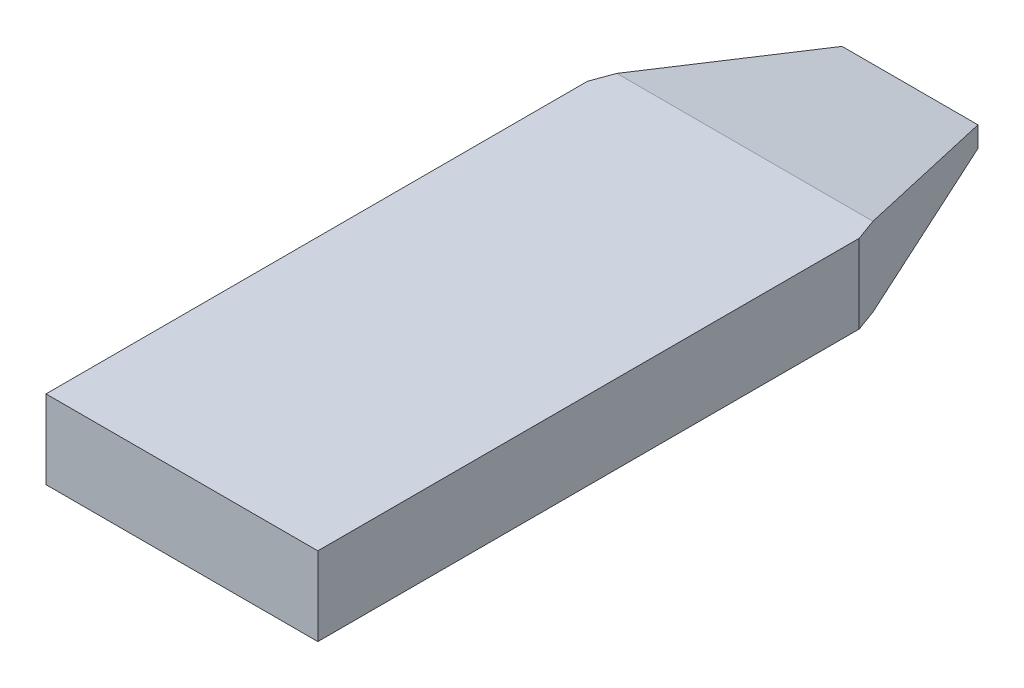
ISO-10303-21;
HEADER;
FILE_DESCRIPTION(('STEP AP214'),'2;1');
FILE_NAME('part.step','',(''),(''),'','','');
FILE_SCHEMA(('AUTOMOTIVE_DESIGN { 1 0 10303 214 1 1 1 1 }'));
ENDSEC;
DATA;
#1=APPLICATION_CONTEXT('core data for automotive mechanical design processes');
#2=APPLICATION_PROTOCOL_DEFINITION('international standard','automotive_design',2000,#1);
#3=PRODUCT_CONTEXT('',#1,'mechanical');
#4=PRODUCT('Part','Part','',(#3));
#5=PRODUCT_RELATED_PRODUCT_CATEGORY('part','',(#4));
#6=PRODUCT_DEFINITION_FORMATION('','',#4);
#7=PRODUCT_DEFINITION_CONTEXT('part definition',#1,'design');
#8=PRODUCT_DEFINITION('design','',#6,#7);
#9=PRODUCT_DEFINITION_SHAPE('','',#8);
#10=(LENGTH_UNIT() NAMED_UNIT(*) SI_UNIT(.MILLI.,.METRE.));
#11=(NAMED_UNIT(*) PLANE_ANGLE_UNIT() SI_UNIT($,.RADIAN.));
#12=(NAMED_UNIT(*) SI_UNIT($,.STERADIAN.) SOLID_ANGLE_UNIT());
#13=UNCERTAINTY_MEASURE_WITH_UNIT(LENGTH_MEASURE(1.E-05),#10,'distance_accuracy_value','');
#14=(GEOMETRIC_REPRESENTATION_CONTEXT(3) GLOBAL_UNCERTAINTY_ASSIGNED_CONTEXT((#13)) GLOBAL_UNIT_ASSIGNED_CONTEXT((#10,
#11,#12)) REPRESENTATION_CONTEXT('',''));
#15=CARTESIAN_POINT('',(0.,0.,0.));
#16=DIRECTION('',(0.,0.,1.));
#17=DIRECTION('',(1.,0.,0.));
#18=AXIS2_PLACEMENT_3D('',#15,#16,#17);
#19=CARTESIAN_POINT('',(3.25,-0.255,-6.64930772705734));
#20=DIRECTION('',(0.,-0.984807753012208,-0.17364817766693));
#21=DIRECTION('',(0.,0.17364817766693,-0.984807753012208));
#22=AXIS2_PLACEMENT_3D('',#19,#20,#21);
#23=PLANE('',#22);
#24=DIRECTION('',(0.337419706756524,-0.163464460888851,0.92705302519255));
#25=VECTOR('',#24,1.);
#26=CARTESIAN_POINT('',(4.65,-0.105,-7.5));
#27=LINE('',#26,#25);
#28=CARTESIAN_POINT('',(4.65,-0.105,-7.5));
#29=VERTEX_POINT('',#28);
#30=CARTESIAN_POINT('',(5.26925333174277,-0.405,-5.79861545411469));
#31=VERTEX_POINT('',#30);
#32=EDGE_CURVE('E11',#29,#31,#27,.T.);
#33=ORIENTED_EDGE('',*,*,#32,.T.);
#34=DIRECTION('',(-1.,0.,0.));
#35=VECTOR('',#34,1.);
#36=CARTESIAN_POINT('',(5.26925333174277,-0.405,-5.79861545411469));
#37=LINE('',#36,#35);
#38=CARTESIAN_POINT('',(2.63074666825723,-0.405,-5.79861545411469));
#39=VERTEX_POINT('',#38);
#40=EDGE_CURVE('E24',#31,#39,#37,.T.);
#41=ORIENTED_EDGE('',*,*,#40,.T.);
#42=DIRECTION('',(0.337419706756524,0.163464460888851,-0.92705302519255));
#43=VECTOR('',#42,1.);
#44=CARTESIAN_POINT('',(2.63074666825723,-0.405,-5.79861545411469));
#45=LINE('',#44,#43);
#46=CARTESIAN_POINT('',(3.25,-0.105,-7.5));
#47=VERTEX_POINT('',#46);
#48=EDGE_CURVE('E142',#39,#47,#45,.T.);
#49=ORIENTED_EDGE('',*,*,#48,.T.);
#50=DIRECTION('',(1.,0.,0.));
#51=VECTOR('',#50,1.);
#52=CARTESIAN_POINT('',(3.25,-0.105,-7.5));
#53=LINE('',#52,#51);
#54=EDGE_CURVE('E140',#47,#29,#53,.T.);
#55=ORIENTED_EDGE('',*,*,#54,.T.);
#56=EDGE_LOOP('',(#33,#41,#49,#55));
#57=FACE_BOUND('',#56,.T.);
#58=ADVANCED_FACE('F17',(#57),#23,.T.);
#59=CARTESIAN_POINT('',(3.95,0.,-7.5));
#60=DIRECTION('',(0.,0.,1.));
#61=DIRECTION('',(1.,0.,0.));
#62=AXIS2_PLACEMENT_3D('',#59,#60,#61);
#63=PLANE('',#62);
#64=ORIENTED_EDGE('',*,*,#54,.F.);
#65=DIRECTION('',(0.,-1.,0.));
#66=VECTOR('',#65,1.);
#67=CARTESIAN_POINT('',(3.25,0.105,-7.5));
#68=LINE('',#67,#66);
#69=CARTESIAN_POINT('',(3.25,0.105,-7.5));
#70=VERTEX_POINT('',#69);
#71=EDGE_CURVE('E137',#70,#47,#68,.T.);
#72=ORIENTED_EDGE('',*,*,#71,.F.);
#73=DIRECTION('',(-1.,0.,0.));
#74=VECTOR('',#73,1.);
#75=CARTESIAN_POINT('',(4.65,0.105,-7.5));
#76=LINE('',#75,#74);
#77=CARTESIAN_POINT('',(4.65,0.105,-7.5));
#78=VERTEX_POINT('',#77);
#79=EDGE_CURVE('E134',#78,#70,#76,.T.);
#80=ORIENTED_EDGE('',*,*,#79,.F.);
#81=DIRECTION('',(0.,1.,0.));
#82=VECTOR('',#81,1.);
#83=CARTESIAN_POINT('',(4.65,-0.105,-7.5));
#84=LINE('',#83,#82);
#85=EDGE_CURVE('E132',#29,#78,#84,.T.);
#86=ORIENTED_EDGE('',*,*,#85,.F.);
#87=EDGE_LOOP('',(#64,#72,#80,#86));
#88=FACE_BOUND('',#87,.T.);
#89=ADVANCED_FACE('F149',(#88),#63,.F.);
#90=CARTESIAN_POINT('',(2.9,0.2025,-6.53838290319088));
#91=DIRECTION('',(-0.939692620785908,0.,-0.342020143325669));
#92=DIRECTION('',(-0.342020143325669,0.,0.939692620785908));
#93=AXIS2_PLACEMENT_3D('',#90,#91,#92);
#94=PLANE('',#93);
#95=ORIENTED_EDGE('',*,*,#48,.F.);
#96=DIRECTION('',(-0.342020143325669,0.,0.939692620785908));
#97=VECTOR('',#96,1.);
#98=CARTESIAN_POINT('',(2.63074666825723,-0.405,-5.79861545411469));
#99=LINE('',#98,#97);
#100=CARTESIAN_POINT('',(2.55,-0.405,-5.57676580638176));
#101=VERTEX_POINT('',#100);
#102=EDGE_CURVE('E130',#39,#101,#99,.T.);
#103=ORIENTED_EDGE('',*,*,#102,.T.);
#104=DIRECTION('',(0.,1.,0.));
#105=VECTOR('',#104,1.);
#106=CARTESIAN_POINT('',(2.55,-0.405,-5.57676580638176));
#107=LINE('',#106,#105);
#108=CARTESIAN_POINT('',(2.55,0.405,-5.57676580638176));
#109=VERTEX_POINT('',#108);
#110=EDGE_CURVE('E96',#101,#109,#107,.T.);
#111=ORIENTED_EDGE('',*,*,#110,.T.);
#112=DIRECTION('',(0.342020143325669,0.,-0.939692620785908));
#113=VECTOR('',#112,1.);
#114=CARTESIAN_POINT('',(2.55,0.405,-5.57676580638176));
#115=LINE('',#114,#113);
#116=CARTESIAN_POINT('',(2.63074666825723,0.405,-5.79861545411469));
#117=VERTEX_POINT('',#116);
#118=EDGE_CURVE('E127',#109,#117,#115,.T.);
#119=ORIENTED_EDGE('',*,*,#118,.T.);
#120=DIRECTION('',(-0.337419706756524,0.163464460888851,0.92705302519255));
#121=VECTOR('',#120,1.);
#122=CARTESIAN_POINT('',(3.25,0.105,-7.5));
#123=LINE('',#122,#121);
#124=EDGE_CURVE('E124',#70,#117,#123,.T.);
#125=ORIENTED_EDGE('',*,*,#124,.F.);
#126=ORIENTED_EDGE('',*,*,#71,.T.);
#127=EDGE_LOOP('',(#95,#103,#111,#119,#125,#126));
#128=FACE_BOUND('',#127,.T.);
#129=ADVANCED_FACE('F146',(#128),#94,.T.);
#130=CARTESIAN_POINT('',(4.65,0.255,-6.64930772705734));
#131=DIRECTION('',(0.,0.984807753012208,-0.17364817766693));
#132=DIRECTION('',(0.,0.17364817766693,0.984807753012208));
#133=AXIS2_PLACEMENT_3D('',#130,#131,#132);
#134=PLANE('',#133);
#135=ORIENTED_EDGE('',*,*,#124,.T.);
#136=DIRECTION('',(1.,0.,0.));
#137=VECTOR('',#136,1.);
#138=CARTESIAN_POINT('',(2.63074666825723,0.405,-5.79861545411469));
#139=LINE('',#138,#137);
#140=CARTESIAN_POINT('',(5.26925333174277,0.405,-5.79861545411469));
#141=VERTEX_POINT('',#140);
#142=EDGE_CURVE('E122',#117,#141,#139,.T.);
#143=ORIENTED_EDGE('',*,*,#142,.T.);
#144=DIRECTION('',(-0.337419706756524,-0.163464460888851,-0.92705302519255));
#145=VECTOR('',#144,1.);
#146=CARTESIAN_POINT('',(5.26925333174277,0.405,-5.79861545411469));
#147=LINE('',#146,#145);
#148=EDGE_CURVE('E119',#141,#78,#147,.T.);
#149=ORIENTED_EDGE('',*,*,#148,.T.);
#150=ORIENTED_EDGE('',*,*,#79,.T.);
#151=EDGE_LOOP('',(#135,#143,#149,#150));
#152=FACE_BOUND('',#151,.T.);
#153=ADVANCED_FACE('F152',(#152),#134,.T.);
#154=CARTESIAN_POINT('',(5.35,0.405,0.));
#155=DIRECTION('',(0.,1.,0.));
#156=DIRECTION('',(0.,0.,1.));
#157=AXIS2_PLACEMENT_3D('',#154,#155,#156);
#158=PLANE('',#157);
#159=ORIENTED_EDGE('',*,*,#142,.F.);
#160=ORIENTED_EDGE('',*,*,#118,.F.);
#161=DIRECTION('',(0.,0.,-1.));
#162=VECTOR('',#161,1.);
#163=CARTESIAN_POINT('',(2.55,0.405,0.));
#164=LINE('',#163,#162);
#165=CARTESIAN_POINT('',(2.55,0.405,0.));
#166=VERTEX_POINT('',#165);
#167=EDGE_CURVE('E117',#166,#109,#164,.T.);
#168=ORIENTED_EDGE('',*,*,#167,.F.);
#169=DIRECTION('',(-1.,0.,0.));
#170=VECTOR('',#169,1.);
#171=CARTESIAN_POINT('',(5.35,0.405,0.));
#172=LINE('',#171,#170);
#173=CARTESIAN_POINT('',(5.35,0.405,0.));
#174=VERTEX_POINT('',#173);
#175=EDGE_CURVE('E101',#174,#166,#172,.T.);
#176=ORIENTED_EDGE('',*,*,#175,.F.);
#177=DIRECTION('',(0.,0.,-1.));
#178=VECTOR('',#177,1.);
#179=CARTESIAN_POINT('',(5.35,0.405,0.));
#180=LINE('',#179,#178);
#181=CARTESIAN_POINT('',(5.35,0.405,-5.57676580638176));
#182=VERTEX_POINT('',#181);
#183=EDGE_CURVE('E114',#174,#182,#180,.T.);
#184=ORIENTED_EDGE('',*,*,#183,.T.);
#185=DIRECTION('',(0.342020143325669,0.,0.939692620785908));
#186=VECTOR('',#185,1.);
#187=CARTESIAN_POINT('',(5.26925333174277,0.405,-5.79861545411469));
#188=LINE('',#187,#186);
#189=EDGE_CURVE('E111',#141,#182,#188,.T.);
#190=ORIENTED_EDGE('',*,*,#189,.F.);
#191=EDGE_LOOP('',(#159,#160,#168,#176,#184,#190));
#192=FACE_BOUND('',#191,.T.);
#193=ADVANCED_FACE('F159',(#192),#158,.T.);
#194=CARTESIAN_POINT('',(2.55,-0.405,0.));
#195=DIRECTION('',(0.,-1.,0.));
#196=DIRECTION('',(0.,0.,-1.));
#197=AXIS2_PLACEMENT_3D('',#194,#195,#196);
#198=PLANE('',#197);
#199=ORIENTED_EDGE('',*,*,#40,.F.);
#200=DIRECTION('',(-0.34202014332567,0.,-0.939692620785908));
#201=VECTOR('',#200,1.);
#202=CARTESIAN_POINT('',(5.35,-0.405,-5.57676580638176));
#203=LINE('',#202,#201);
#204=CARTESIAN_POINT('',(5.35,-0.405,-5.57676580638176));
#205=VERTEX_POINT('',#204);
#206=EDGE_CURVE('E109',#205,#31,#203,.T.);
#207=ORIENTED_EDGE('',*,*,#206,.F.);
#208=DIRECTION('',(0.,0.,-1.));
#209=VECTOR('',#208,1.);
#210=CARTESIAN_POINT('',(5.35,-0.405,0.));
#211=LINE('',#210,#209);
#212=CARTESIAN_POINT('',(5.35,-0.405,0.));
#213=VERTEX_POINT('',#212);
#214=EDGE_CURVE('E84',#213,#205,#211,.T.);
#215=ORIENTED_EDGE('',*,*,#214,.F.);
#216=DIRECTION('',(1.,0.,0.));
#217=VECTOR('',#216,1.);
#218=CARTESIAN_POINT('',(2.55,-0.405,0.));
#219=LINE('',#218,#217);
#220=CARTESIAN_POINT('',(2.55,-0.405,0.));
#221=VERTEX_POINT('',#220);
#222=EDGE_CURVE('E78',#221,#213,#219,.T.);
#223=ORIENTED_EDGE('',*,*,#222,.F.);
#224=DIRECTION('',(0.,0.,-1.));
#225=VECTOR('',#224,1.);
#226=CARTESIAN_POINT('',(2.55,-0.405,0.));
#227=LINE('',#226,#225);
#228=EDGE_CURVE('E82',#221,#101,#227,.T.);
#229=ORIENTED_EDGE('',*,*,#228,.T.);
#230=ORIENTED_EDGE('',*,*,#102,.F.);
#231=EDGE_LOOP('',(#199,#207,#215,#223,#229,#230));
#232=FACE_BOUND('',#231,.T.);
#233=ADVANCED_FACE('F80',(#232),#198,.T.);
#234=CARTESIAN_POINT('',(5.,-0.2025,-6.53838290319088));
#235=DIRECTION('',(0.939692620785908,0.,-0.342020143325669));
#236=DIRECTION('',(-0.342020143325669,0.,-0.939692620785908));
#237=AXIS2_PLACEMENT_3D('',#234,#235,#236);
#238=PLANE('',#237);
#239=ORIENTED_EDGE('',*,*,#32,.F.);
#240=ORIENTED_EDGE('',*,*,#85,.T.);
#241=ORIENTED_EDGE('',*,*,#148,.F.);
#242=ORIENTED_EDGE('',*,*,#189,.T.);
#243=DIRECTION('',(0.,-1.,0.));
#244=VECTOR('',#243,1.);
#245=CARTESIAN_POINT('',(5.35,0.405,-5.57676580638176));
#246=LINE('',#245,#244);
#247=EDGE_CURVE('E97',#182,#205,#246,.T.);
#248=ORIENTED_EDGE('',*,*,#247,.T.);
#249=ORIENTED_EDGE('',*,*,#206,.T.);
#250=EDGE_LOOP('',(#239,#240,#241,#242,#248,#249));
#251=FACE_BOUND('',#250,.T.);
#252=ADVANCED_FACE('F156',(#251),#238,.T.);
#253=CARTESIAN_POINT('',(2.55,0.405,0.));
#254=DIRECTION('',(-1.,0.,0.));
#255=DIRECTION('',(0.,0.,1.));
#256=AXIS2_PLACEMENT_3D('',#253,#254,#255);
#257=PLANE('',#256);
#258=ORIENTED_EDGE('',*,*,#110,.F.);
#259=ORIENTED_EDGE('',*,*,#228,.F.);
#260=DIRECTION('',(0.,-1.,0.));
#261=VECTOR('',#260,1.);
#262=CARTESIAN_POINT('',(2.55,0.405,0.));
#263=LINE('',#262,#261);
#264=EDGE_CURVE('E95',#166,#221,#263,.T.);
#265=ORIENTED_EDGE('',*,*,#264,.F.);
#266=ORIENTED_EDGE('',*,*,#167,.T.);
#267=EDGE_LOOP('',(#258,#259,#265,#266));
#268=FACE_BOUND('',#267,.T.);
#269=ADVANCED_FACE('F93',(#268),#257,.T.);
#270=CARTESIAN_POINT('',(5.35,-0.405,0.));
#271=DIRECTION('',(1.,0.,0.));
#272=DIRECTION('',(0.,0.,-1.));
#273=AXIS2_PLACEMENT_3D('',#270,#271,#272);
#274=PLANE('',#273);
#275=ORIENTED_EDGE('',*,*,#247,.F.);
#276=ORIENTED_EDGE('',*,*,#183,.F.);
#277=DIRECTION('',(0.,1.,0.));
#278=VECTOR('',#277,1.);
#279=CARTESIAN_POINT('',(5.35,-0.405,0.));
#280=LINE('',#279,#278);
#281=EDGE_CURVE('E102',#213,#174,#280,.T.);
#282=ORIENTED_EDGE('',*,*,#281,.F.);
#283=ORIENTED_EDGE('',*,*,#214,.T.);
#284=EDGE_LOOP('',(#275,#276,#282,#283));
#285=FACE_BOUND('',#284,.T.);
#286=ADVANCED_FACE('F163',(#285),#274,.T.);
#287=CARTESIAN_POINT('',(3.95,0.,0.));
#288=DIRECTION('',(0.,0.,1.));
#289=DIRECTION('',(1.,0.,0.));
#290=AXIS2_PLACEMENT_3D('',#287,#288,#289);
#291=PLANE('',#290);
#292=ORIENTED_EDGE('',*,*,#175,.T.);
#293=ORIENTED_EDGE('',*,*,#264,.T.);
#294=ORIENTED_EDGE('',*,*,#222,.T.);
#295=ORIENTED_EDGE('',*,*,#281,.T.);
#296=EDGE_LOOP('',(#292,#293,#294,#295));
#297=FACE_BOUND('',#296,.T.);
#298=ADVANCED_FACE('F100',(#297),#291,.T.);
#299=CLOSED_SHELL('',(#58,#89,#129,#153,#193,#233,#252,#269,#286,#298));
#300=MANIFOLD_SOLID_BREP('B1',#299);
#301=ADVANCED_BREP_SHAPE_REPRESENTATION('',(#18,#300),#14);
#302=SHAPE_DEFINITION_REPRESENTATION(#9,#301);
ENDSEC;
END-ISO-10303-21;
